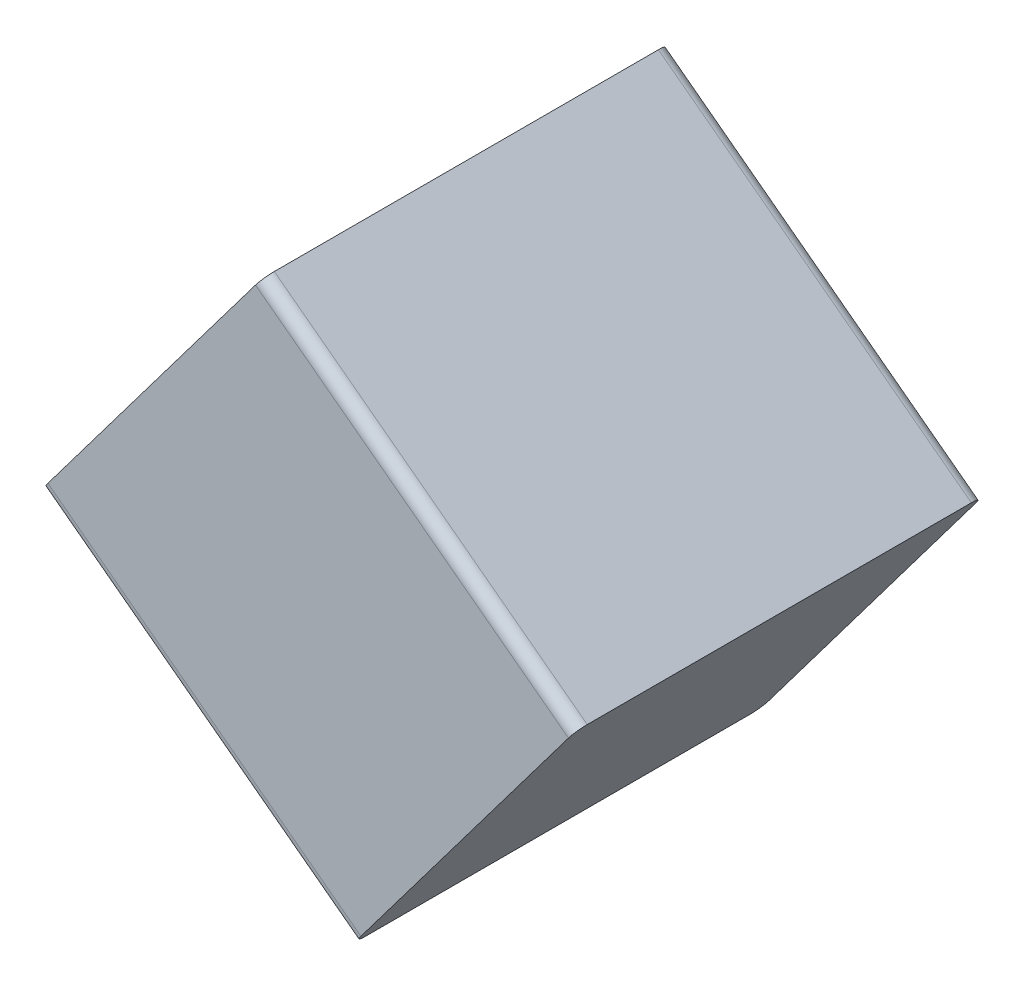
ISO-10303-21;
HEADER;
FILE_DESCRIPTION(('STEP AP214'),'2;1');
FILE_NAME('part.step','',(''),(''),'','','');
FILE_SCHEMA(('AUTOMOTIVE_DESIGN { 1 0 10303 214 1 1 1 1 }'));
ENDSEC;
DATA;
#1=APPLICATION_CONTEXT('core data for automotive mechanical design processes');
#2=APPLICATION_PROTOCOL_DEFINITION('international standard','automotive_design',2000,#1);
#3=PRODUCT_CONTEXT('',#1,'mechanical');
#4=PRODUCT('Part','Part','',(#3));
#5=PRODUCT_RELATED_PRODUCT_CATEGORY('part','',(#4));
#6=PRODUCT_DEFINITION_FORMATION('','',#4);
#7=PRODUCT_DEFINITION_CONTEXT('part definition',#1,'design');
#8=PRODUCT_DEFINITION('design','',#6,#7);
#9=PRODUCT_DEFINITION_SHAPE('','',#8);
#10=(LENGTH_UNIT() NAMED_UNIT(*) SI_UNIT(.MILLI.,.METRE.));
#11=(NAMED_UNIT(*) PLANE_ANGLE_UNIT() SI_UNIT($,.RADIAN.));
#12=(NAMED_UNIT(*) SI_UNIT($,.STERADIAN.) SOLID_ANGLE_UNIT());
#13=UNCERTAINTY_MEASURE_WITH_UNIT(LENGTH_MEASURE(1.E-05),#10,'distance_accuracy_value','');
#14=(GEOMETRIC_REPRESENTATION_CONTEXT(3) GLOBAL_UNCERTAINTY_ASSIGNED_CONTEXT((#13)) GLOBAL_UNIT_ASSIGNED_CONTEXT((#10,
#11,#12)) REPRESENTATION_CONTEXT('',''));
#15=CARTESIAN_POINT('',(0.,0.,0.));
#16=DIRECTION('',(0.,0.,1.));
#17=DIRECTION('',(1.,0.,0.));
#18=AXIS2_PLACEMENT_3D('',#15,#16,#17);
#19=CARTESIAN_POINT('',(-14.15891525389,15.037224992808,-2.146602064666));
#20=DIRECTION('',(0.,8.74227771443697E-08,-0.999999999999996));
#21=DIRECTION('',(0.,0.999999999999996,8.74227771443697E-08));
#22=AXIS2_PLACEMENT_3D('',#19,#20,#21);
#23=PLANE('',#22);
#24=DIRECTION('',(-0.798635539967121,0.601814983447091,5.2612335661528E-08));
#25=VECTOR('',#24,1.);
#26=CARTESIAN_POINT('',(-14.4327410713787,14.6738458221011,-2.146602096433));
#27=LINE('',#26,#25);
#28=CARTESIAN_POINT('',(-14.8320588416746,14.974753313403,-2.14660205476692));
#29=VERTEX_POINT('',#28);
#30=CARTESIAN_POINT('',(-14.4327410716943,14.6738458216819,-2.146602081073));
#31=VERTEX_POINT('',#30);
#32=EDGE_CURVE('E83',#29,#31,#27,.F.);
#33=ORIENTED_EDGE('',*,*,#32,.F.);
#34=DIRECTION('',(-0.601814983447092,-0.798635539967122,0.));
#35=VECTOR('',#34,1.);
#36=CARTESIAN_POINT('',(-14.6996595559147,15.1504531181353,-2.146602039407));
#37=LINE('',#36,#35);
#38=CARTESIAN_POINT('',(-14.5672602489388,15.3261529510136,-2.14660203940696));
#39=VERTEX_POINT('',#38);
#40=EDGE_CURVE('E86',#39,#29,#37,.T.);
#41=ORIENTED_EDGE('',*,*,#40,.F.);
#42=DIRECTION('',(-0.798635539967121,0.601814983447091,5.2612335661528E-08));
#43=VECTOR('',#42,1.);
#44=CARTESIAN_POINT('',(-14.1679424786402,15.0252454597081,-2.146602065713));
#45=LINE('',#44,#43);
#46=CARTESIAN_POINT('',(-14.1679424789546,15.0252454592895,-2.146602065713));
#47=VERTEX_POINT('',#46);
#48=EDGE_CURVE('E127',#47,#39,#45,.T.);
#49=ORIENTED_EDGE('',*,*,#48,.F.);
#50=DIRECTION('',(-0.601814983447092,-0.798635539967122,0.));
#51=VECTOR('',#50,1.);
#52=CARTESIAN_POINT('',(-14.3003417859247,14.8495456264114,-2.146602065713));
#53=LINE('',#52,#51);
#54=EDGE_CURVE('E87',#47,#31,#53,.T.);
#55=ORIENTED_EDGE('',*,*,#54,.T.);
#56=EDGE_LOOP('',(#33,#41,#49,#55));
#57=FACE_BOUND('',#56,.T.);
#58=ADVANCED_FACE('F17',(#57),#23,.T.);
#59=CARTESIAN_POINT('',(-14.43274107138,14.673845820788,-2.131602096433));
#60=DIRECTION('',(-0.798635539967121,0.601814983447091,5.2612335661528E-08));
#61=DIRECTION('',(-0.601814983447092,-0.798635539967122,0.));
#62=AXIS2_PLACEMENT_3D('',#59,#60,#61);
#63=CYLINDRICAL_SURFACE('',#62,0.015);
#64=CARTESIAN_POINT('',(-14.4327410713798,14.6738458207879,-2.131602096433));
#65=DIRECTION('',(-0.798635539967121,0.601814983447091,5.2612335661528E-08));
#66=DIRECTION('',(-0.601814983447092,-0.798635539967122,0.));
#67=AXIS2_PLACEMENT_3D('',#64,#65,#66);
#68=CIRCLE('',#67,0.015);
#69=CARTESIAN_POINT('',(-14.4417682961286,14.6618662876865,-2.1316020838035));
#70=VERTEX_POINT('',#69);
#71=EDGE_CURVE('E120',#31,#70,#68,.T.);
#72=ORIENTED_EDGE('',*,*,#71,.T.);
#73=DIRECTION('',(0.798635539967122,-0.601814983447092,0.));
#74=VECTOR('',#73,1.);
#75=CARTESIAN_POINT('',(-14.4417682967603,14.6618662881626,-2.131602071174));
#76=LINE('',#75,#74);
#77=CARTESIAN_POINT('',(-14.8410860661114,14.9627737794122,-2.13160207065042));
#78=VERTEX_POINT('',#77);
#79=EDGE_CURVE('E20',#78,#70,#76,.T.);
#80=ORIENTED_EDGE('',*,*,#79,.F.);
#81=CARTESIAN_POINT('',(-14.8320588413602,14.974753312509,-2.13160207012683));
#82=DIRECTION('',(-0.798635539967121,0.601814983447091,5.2612335661528E-08));
#83=DIRECTION('',(-0.601814983447092,-0.798635539967122,0.));
#84=AXIS2_PLACEMENT_3D('',#81,#82,#83);
#85=CIRCLE('',#84,0.015);
#86=EDGE_CURVE('E91',#29,#78,#85,.T.);
#87=ORIENTED_EDGE('',*,*,#86,.F.);
#88=ORIENTED_EDGE('',*,*,#32,.T.);
#89=EDGE_LOOP('',(#72,#80,#87,#88));
#90=FACE_BOUND('',#89,.T.);
#91=ADVANCED_FACE('F92',(#90),#63,.T.);
#92=CARTESIAN_POINT('',(-14.44176829613,14.661866288999,-2.146602097481));
#93=DIRECTION('',(-0.601814983447091,-0.79863553996712,-6.98189379744105E-08));
#94=DIRECTION('',(0.798635539967122,-0.601814983447092,0.));
#95=AXIS2_PLACEMENT_3D('',#92,#93,#94);
#96=PLANE('',#95);
#97=DIRECTION('',(0.798635539967122,-0.601814983447092,0.));
#98=VECTOR('',#97,1.);
#99=CARTESIAN_POINT('',(-14.4417683173491,14.6618662608403,-1.6416020975));
#100=LINE('',#99,#98);
#101=CARTESIAN_POINT('',(-14.8410860558175,14.9627737502357,-1.64160208382342));
#102=VERTEX_POINT('',#101);
#103=CARTESIAN_POINT('',(-14.4417682858357,14.661866258512,-1.6416020969765));
#104=VERTEX_POINT('',#103);
#105=EDGE_CURVE('E125',#102,#104,#100,.T.);
#106=ORIENTED_EDGE('',*,*,#105,.F.);
#107=DIRECTION('',(4.20180810999759E-08,-3.16628919152553E-08,0.999999999999999));
#108=VECTOR('',#107,1.);
#109=CARTESIAN_POINT('',(-14.8410860558176,14.9627737716561,-1.886602054794));
#110=LINE('',#109,#108);
#111=EDGE_CURVE('E95',#78,#102,#110,.T.);
#112=ORIENTED_EDGE('',*,*,#111,.F.);
#113=ORIENTED_EDGE('',*,*,#79,.T.);
#114=DIRECTION('',(4.20180810999759E-08,-3.16628919152553E-08,0.999999999999999));
#115=VECTOR('',#114,1.);
#116=CARTESIAN_POINT('',(-14.4417682858312,14.6618662799273,-1.8866020811));
#117=LINE('',#116,#115);
#118=EDGE_CURVE('E118',#70,#104,#117,.T.);
#119=ORIENTED_EDGE('',*,*,#118,.T.);
#120=EDGE_LOOP('',(#106,#112,#113,#119));
#121=FACE_BOUND('',#120,.T.);
#122=ADVANCED_FACE('F146',(#121),#96,.T.);
#123=CARTESIAN_POINT('',(-14.43274107138,14.67384577795,-1.641602096453));
#124=DIRECTION('',(-0.798635539967121,0.601814983447091,5.2612335661528E-08));
#125=DIRECTION('',(-0.601814983447092,-0.798635539967122,0.));
#126=AXIS2_PLACEMENT_3D('',#123,#124,#125);
#127=CYLINDRICAL_SURFACE('',#126,0.015);
#128=CARTESIAN_POINT('',(-14.4327410713792,14.6738457779494,-1.641602096453));
#129=DIRECTION('',(-0.798635539967121,0.601814983447091,5.2612335661528E-08));
#130=DIRECTION('',(-0.601814983447092,-0.798635539967122,0.));
#131=AXIS2_PLACEMENT_3D('',#128,#129,#130);
#132=CIRCLE('',#131,0.015);
#133=CARTESIAN_POINT('',(-14.4327410710617,14.6738457770546,-1.62660209645293));
#134=VERTEX_POINT('',#133);
#135=EDGE_CURVE('E117',#104,#134,#132,.T.);
#136=ORIENTED_EDGE('',*,*,#135,.T.);
#137=DIRECTION('',(0.798635539964107,-0.601814983451091,-5.26123359291461E-08));
#138=VECTOR('',#137,1.);
#139=CARTESIAN_POINT('',(-14.83205884136,14.974753268363,-1.62660207014655));
#140=LINE('',#139,#138);
#141=CARTESIAN_POINT('',(-14.8320588410462,14.9747532687804,-1.62660207014689));
#142=VERTEX_POINT('',#141);
#143=EDGE_CURVE('E123',#142,#134,#140,.T.);
#144=ORIENTED_EDGE('',*,*,#143,.F.);
#145=CARTESIAN_POINT('',(-14.8320588413617,14.9747532696721,-1.64160207014683));
#146=DIRECTION('',(-0.798635539967121,0.601814983447091,5.2612335661528E-08));
#147=DIRECTION('',(-0.601814983447092,-0.798635539967122,0.));
#148=AXIS2_PLACEMENT_3D('',#145,#146,#147);
#149=CIRCLE('',#148,0.015);
#150=EDGE_CURVE('E132',#102,#142,#149,.T.);
#151=ORIENTED_EDGE('',*,*,#150,.F.);
#152=ORIENTED_EDGE('',*,*,#105,.T.);
#153=EDGE_LOOP('',(#136,#144,#151,#152));
#154=FACE_BOUND('',#153,.T.);
#155=ADVANCED_FACE('F152',(#154),#127,.T.);
#156=CARTESIAN_POINT('',(-14.44176829613,14.66186624354,-1.6266020975));
#157=DIRECTION('',(0.,-8.74227771443697E-08,0.999999999999996));
#158=DIRECTION('',(0.,-0.999999999999996,-8.74227771443697E-08));
#159=AXIS2_PLACEMENT_3D('',#156,#157,#158);
#160=PLANE('',#159);
#161=ORIENTED_EDGE('',*,*,#143,.T.);
#162=DIRECTION('',(-0.601814983447092,-0.798635539967122,0.));
#163=VECTOR('',#162,1.);
#164=CARTESIAN_POINT('',(-14.3003417640753,14.8495456099467,-1.626602096453));
#165=LINE('',#164,#163);
#166=CARTESIAN_POINT('',(-14.167942478324,15.0252454146674,-1.626602081093));
#167=VERTEX_POINT('',#166);
#168=EDGE_CURVE('E114',#134,#167,#165,.F.);
#169=ORIENTED_EDGE('',*,*,#168,.T.);
#170=DIRECTION('',(-0.798635539967121,0.601814983447091,5.2612335661528E-08));
#171=VECTOR('',#170,1.);
#172=CARTESIAN_POINT('',(-14.1679424786388,15.0252454142502,-1.626602065733));
#173=LINE('',#172,#171);
#174=CARTESIAN_POINT('',(-14.5672602483066,15.3261529063903,-1.62660205478692));
#175=VERTEX_POINT('',#174);
#176=EDGE_CURVE('E122',#175,#167,#173,.F.);
#177=ORIENTED_EDGE('',*,*,#176,.F.);
#178=DIRECTION('',(-0.601814983447092,-0.798635539967122,0.));
#179=VECTOR('',#178,1.);
#180=CARTESIAN_POINT('',(-14.6996595340653,15.1504531016706,-1.626602070147));
#181=LINE('',#180,#179);
#182=EDGE_CURVE('E111',#142,#175,#181,.F.);
#183=ORIENTED_EDGE('',*,*,#182,.F.);
#184=EDGE_LOOP('',(#161,#169,#177,#183));
#185=FACE_BOUND('',#184,.T.);
#186=ADVANCED_FACE('F155',(#185),#160,.T.);
#187=CARTESIAN_POINT('',(-14.16794247864,15.02524541556,-1.641602065733));
#188=DIRECTION('',(-0.798635539967121,0.601814983447091,5.2612335661528E-08));
#189=DIRECTION('',(-0.601814983447092,-0.798635539967122,0.));
#190=AXIS2_PLACEMENT_3D('',#187,#188,#189);
#191=CYLINDRICAL_SURFACE('',#190,0.015);
#192=CARTESIAN_POINT('',(-14.1679424786397,15.0252454155598,-1.641602065733));
#193=DIRECTION('',(-0.798635539967121,0.601814983447091,5.2612335661528E-08));
#194=DIRECTION('',(-0.601814983447092,-0.798635539967122,0.));
#195=AXIS2_PLACEMENT_3D('',#192,#193,#194);
#196=CIRCLE('',#195,0.015);
#197=CARTESIAN_POINT('',(-14.1589152538889,15.0372249486592,-1.6416020518297));
#198=VERTEX_POINT('',#197);
#199=EDGE_CURVE('E116',#167,#198,#196,.T.);
#200=ORIENTED_EDGE('',*,*,#199,.T.);
#201=DIRECTION('',(-0.798635539967122,0.601814983447092,0.));
#202=VECTOR('',#201,1.);
#203=CARTESIAN_POINT('',(-14.1589152532597,15.0372249481844,-1.641602038379));
#204=LINE('',#203,#202);
#205=CARTESIAN_POINT('',(-14.5582330283201,15.338132455896,-1.64160203867662));
#206=VERTEX_POINT('',#205);
#207=EDGE_CURVE('E108',#206,#198,#204,.F.);
#208=ORIENTED_EDGE('',*,*,#207,.F.);
#209=CARTESIAN_POINT('',(-14.5672602486224,15.3261529072826,-1.64160203942683));
#210=DIRECTION('',(-0.798635539967121,0.601814983447091,5.2612335661528E-08));
#211=DIRECTION('',(-0.601814983447092,-0.798635539967122,0.));
#212=AXIS2_PLACEMENT_3D('',#209,#210,#211);
#213=CIRCLE('',#212,0.015);
#214=EDGE_CURVE('E100',#175,#206,#213,.T.);
#215=ORIENTED_EDGE('',*,*,#214,.F.);
#216=ORIENTED_EDGE('',*,*,#176,.T.);
#217=EDGE_LOOP('',(#200,#208,#215,#216));
#218=FACE_BOUND('',#217,.T.);
#219=ADVANCED_FACE('F163',(#218),#191,.T.);
#220=CARTESIAN_POINT('',(-14.300341775,14.849545618179,-1.8866020811));
#221=DIRECTION('',(-0.798635539967121,0.601814983447091,5.2612335661528E-08));
#222=DIRECTION('',(-0.601814983447092,-0.798635539967122,0.));
#223=AXIS2_PLACEMENT_3D('',#220,#221,#222);
#224=PLANE('',#223);
#225=ORIENTED_EDGE('',*,*,#168,.F.);
#226=ORIENTED_EDGE('',*,*,#135,.F.);
#227=ORIENTED_EDGE('',*,*,#118,.F.);
#228=ORIENTED_EDGE('',*,*,#71,.F.);
#229=ORIENTED_EDGE('',*,*,#54,.F.);
#230=CARTESIAN_POINT('',(-14.1679424786408,15.0252454583976,-2.131602065713));
#231=DIRECTION('',(-0.798635539967121,0.601814983447091,5.2612335661528E-08));
#232=DIRECTION('',(-0.601814983447092,-0.798635539967122,0.));
#233=AXIS2_PLACEMENT_3D('',#230,#231,#232);
#234=CIRCLE('',#233,0.015);
#235=CARTESIAN_POINT('',(-14.158915249441,15.0372249759816,-2.13160206496321));
#236=VERTEX_POINT('',#235);
#237=EDGE_CURVE('E129',#236,#47,#234,.T.);
#238=ORIENTED_EDGE('',*,*,#237,.F.);
#239=DIRECTION('',(-4.20180830013634E-08,-5.57598852291243E-08,0.999999999999998));
#240=VECTOR('',#239,1.);
#241=CARTESIAN_POINT('',(-14.1589152545201,15.0372249478228,-1.626602064685));
#242=LINE('',#241,#240);
#243=EDGE_CURVE('E106',#198,#236,#242,.F.);
#244=ORIENTED_EDGE('',*,*,#243,.F.);
#245=ORIENTED_EDGE('',*,*,#199,.F.);
#246=EDGE_LOOP('',(#225,#226,#227,#228,#229,#238,#244,#245));
#247=FACE_BOUND('',#246,.T.);
#248=ADVANCED_FACE('F149',(#247),#224,.F.);
#249=CARTESIAN_POINT('',(-14.16794247864,15.025245458397,-2.131602065713));
#250=DIRECTION('',(-0.798635539967121,0.601814983447091,5.2612335661528E-08));
#251=DIRECTION('',(-0.601814983447092,-0.798635539967122,0.));
#252=AXIS2_PLACEMENT_3D('',#249,#250,#251);
#253=CYLINDRICAL_SURFACE('',#252,0.015);
#254=ORIENTED_EDGE('',*,*,#237,.T.);
#255=ORIENTED_EDGE('',*,*,#48,.T.);
#256=CARTESIAN_POINT('',(-14.5672602486213,15.3261529501189,-2.13160203940683));
#257=DIRECTION('',(-0.798635539967121,0.601814983447091,5.2612335661528E-08));
#258=DIRECTION('',(-0.601814983447092,-0.798635539967122,0.));
#259=AXIS2_PLACEMENT_3D('',#256,#257,#258);
#260=CIRCLE('',#259,0.015);
#261=CARTESIAN_POINT('',(-14.5582330238705,15.3381324832184,-2.1316020515125));
#262=VERTEX_POINT('',#261);
#263=EDGE_CURVE('E35',#262,#39,#260,.T.);
#264=ORIENTED_EDGE('',*,*,#263,.F.);
#265=DIRECTION('',(-0.798635539967122,0.601814983447092,0.));
#266=VECTOR('',#265,1.);
#267=CARTESIAN_POINT('',(-14.1589152326709,15.0372249755067,-2.131602064666));
#268=LINE('',#267,#266);
#269=EDGE_CURVE('E26',#236,#262,#268,.T.);
#270=ORIENTED_EDGE('',*,*,#269,.F.);
#271=EDGE_LOOP('',(#254,#255,#264,#270));
#272=FACE_BOUND('',#271,.T.);
#273=ADVANCED_FACE('F162',(#272),#253,.T.);
#274=CARTESIAN_POINT('',(-14.69965954499,15.150453109903,-1.886602054794));
#275=DIRECTION('',(-0.798635539967121,0.601814983447091,5.2612335661528E-08));
#276=DIRECTION('',(-0.601814983447092,-0.798635539967122,0.));
#277=AXIS2_PLACEMENT_3D('',#274,#275,#276);
#278=PLANE('',#277);
#279=ORIENTED_EDGE('',*,*,#150,.T.);
#280=ORIENTED_EDGE('',*,*,#182,.T.);
#281=ORIENTED_EDGE('',*,*,#214,.T.);
#282=DIRECTION('',(-4.20180830013634E-08,-5.57598852291243E-08,0.999999999999998));
#283=VECTOR('',#282,1.);
#284=CARTESIAN_POINT('',(-14.5582330450904,15.3381324550596,-1.626602064685));
#285=LINE('',#284,#283);
#286=EDGE_CURVE('E11',#262,#206,#285,.T.);
#287=ORIENTED_EDGE('',*,*,#286,.F.);
#288=ORIENTED_EDGE('',*,*,#263,.T.);
#289=ORIENTED_EDGE('',*,*,#40,.T.);
#290=ORIENTED_EDGE('',*,*,#86,.T.);
#291=ORIENTED_EDGE('',*,*,#111,.T.);
#292=EDGE_LOOP('',(#279,#280,#281,#287,#288,#289,#290,#291));
#293=FACE_BOUND('',#292,.T.);
#294=ADVANCED_FACE('F98',(#293),#278,.T.);
#295=CARTESIAN_POINT('',(-14.15891525389,15.037224947348,-1.626602064685));
#296=DIRECTION('',(0.601814983447091,0.79863553996712,6.98189379744105E-08));
#297=DIRECTION('',(-0.798635539967122,0.601814983447092,0.));
#298=AXIS2_PLACEMENT_3D('',#295,#296,#297);
#299=PLANE('',#298);
#300=ORIENTED_EDGE('',*,*,#269,.T.);
#301=ORIENTED_EDGE('',*,*,#286,.T.);
#302=ORIENTED_EDGE('',*,*,#207,.T.);
#303=ORIENTED_EDGE('',*,*,#243,.T.);
#304=EDGE_LOOP('',(#300,#301,#302,#303));
#305=FACE_BOUND('',#304,.T.);
#306=ADVANCED_FACE('F160',(#305),#299,.T.);
#307=CLOSED_SHELL('',(#58,#91,#122,#155,#186,#219,#248,#273,#294,#306));
#308=MANIFOLD_SOLID_BREP('B1',#307);
#309=ADVANCED_BREP_SHAPE_REPRESENTATION('',(#18,#308),#14);
#310=SHAPE_DEFINITION_REPRESENTATION(#9,#309);
ENDSEC;
END-ISO-10303-21;
